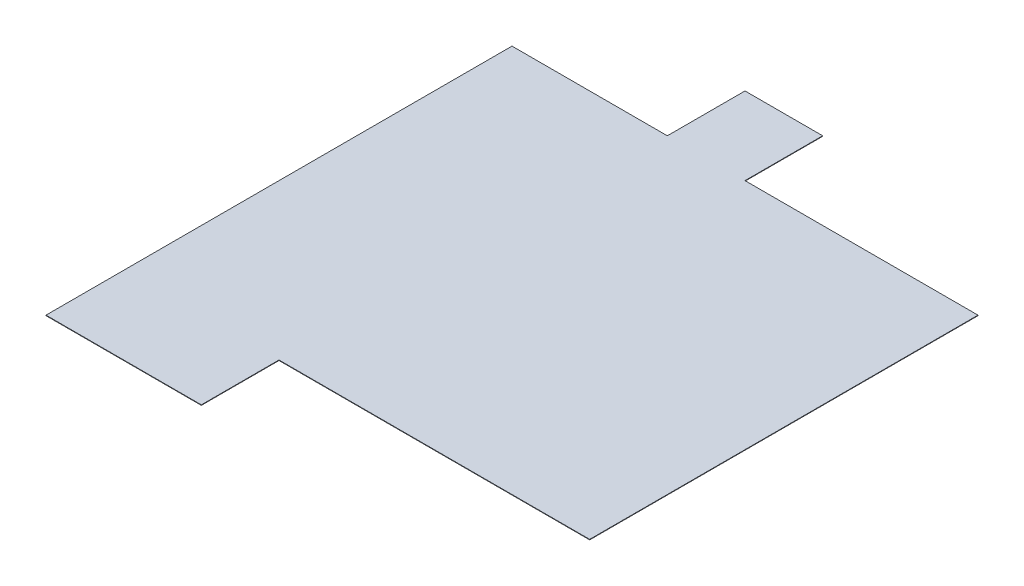
ISO-10303-21;
HEADER;
FILE_DESCRIPTION(('STEP AP214'),'2;1');
FILE_NAME('part.step','',(''),(''),'','','');
FILE_SCHEMA(('AUTOMOTIVE_DESIGN { 1 0 10303 214 1 1 1 1 }'));
ENDSEC;
DATA;
#1=APPLICATION_CONTEXT('core data for automotive mechanical design processes');
#2=APPLICATION_PROTOCOL_DEFINITION('international standard','automotive_design',2000,#1);
#3=PRODUCT_CONTEXT('',#1,'mechanical');
#4=PRODUCT('Part','Part','',(#3));
#5=PRODUCT_RELATED_PRODUCT_CATEGORY('part','',(#4));
#6=PRODUCT_DEFINITION_FORMATION('','',#4);
#7=PRODUCT_DEFINITION_CONTEXT('part definition',#1,'design');
#8=PRODUCT_DEFINITION('design','',#6,#7);
#9=PRODUCT_DEFINITION_SHAPE('','',#8);
#10=(LENGTH_UNIT() NAMED_UNIT(*) SI_UNIT(.MILLI.,.METRE.));
#11=(NAMED_UNIT(*) PLANE_ANGLE_UNIT() SI_UNIT($,.RADIAN.));
#12=(NAMED_UNIT(*) SI_UNIT($,.STERADIAN.) SOLID_ANGLE_UNIT());
#13=UNCERTAINTY_MEASURE_WITH_UNIT(LENGTH_MEASURE(1.E-05),#10,'distance_accuracy_value','');
#14=(GEOMETRIC_REPRESENTATION_CONTEXT(3) GLOBAL_UNCERTAINTY_ASSIGNED_CONTEXT((#13)) GLOBAL_UNIT_ASSIGNED_CONTEXT((#10,
#11,#12)) REPRESENTATION_CONTEXT('',''));
#15=CARTESIAN_POINT('',(0.,0.,0.));
#16=DIRECTION('',(0.,0.,1.));
#17=DIRECTION('',(1.,0.,0.));
#18=AXIS2_PLACEMENT_3D('',#15,#16,#17);
#19=CARTESIAN_POINT('',(-2400.,5.,-2800.));
#20=DIRECTION('',(0.,0.,1.));
#21=DIRECTION('',(1.,0.,0.));
#22=AXIS2_PLACEMENT_3D('',#19,#20,#21);
#23=PLANE('',#22);
#24=DIRECTION('',(0.,-1.,0.));
#25=VECTOR('',#24,1.);
#26=CARTESIAN_POINT('',(0.,5.,-2800.));
#27=LINE('',#26,#25);
#28=CARTESIAN_POINT('',(0.,5.,-2800.));
#29=VERTEX_POINT('',#28);
#30=CARTESIAN_POINT('',(0.,0.,-2800.));
#31=VERTEX_POINT('',#30);
#32=EDGE_CURVE('E119',#29,#31,#27,.T.);
#33=ORIENTED_EDGE('',*,*,#32,.F.);
#34=DIRECTION('',(-1.,0.,0.));
#35=VECTOR('',#34,1.);
#36=CARTESIAN_POINT('',(-2400.,5.,-2800.));
#37=LINE('',#36,#35);
#38=CARTESIAN_POINT('',(2400.,5.,-2800.));
#39=VERTEX_POINT('',#38);
#40=EDGE_CURVE('E130',#39,#29,#37,.T.);
#41=ORIENTED_EDGE('',*,*,#40,.F.);
#42=DIRECTION('',(0.,-1.,0.));
#43=VECTOR('',#42,1.);
#44=CARTESIAN_POINT('',(2400.,5.,-2800.));
#45=LINE('',#44,#43);
#46=CARTESIAN_POINT('',(2400.,0.,-2800.));
#47=VERTEX_POINT('',#46);
#48=EDGE_CURVE('E11',#39,#47,#45,.T.);
#49=ORIENTED_EDGE('',*,*,#48,.T.);
#50=DIRECTION('',(-1.,0.,0.));
#51=VECTOR('',#50,1.);
#52=CARTESIAN_POINT('',(-2400.,0.,-2800.));
#53=LINE('',#52,#51);
#54=EDGE_CURVE('E133',#47,#31,#53,.T.);
#55=ORIENTED_EDGE('',*,*,#54,.T.);
#56=EDGE_LOOP('',(#33,#41,#49,#55));
#57=FACE_BOUND('',#56,.T.);
#58=ADVANCED_FACE('F36',(#57),#23,.F.);
#59=CARTESIAN_POINT('',(2400.,5.,-2800.));
#60=DIRECTION('',(-1.,0.,0.));
#61=DIRECTION('',(0.,0.,1.));
#62=AXIS2_PLACEMENT_3D('',#59,#60,#61);
#63=PLANE('',#62);
#64=DIRECTION('',(0.,-1.,0.));
#65=VECTOR('',#64,1.);
#66=CARTESIAN_POINT('',(2400.00000000003,5.,1200.));
#67=LINE('',#66,#65);
#68=CARTESIAN_POINT('',(2400.00000000003,5.,1200.));
#69=VERTEX_POINT('',#68);
#70=CARTESIAN_POINT('',(2400.00000000003,0.,1200.));
#71=VERTEX_POINT('',#70);
#72=EDGE_CURVE('E152',#69,#71,#67,.T.);
#73=ORIENTED_EDGE('',*,*,#72,.T.);
#74=DIRECTION('',(0.,0.,-1.));
#75=VECTOR('',#74,1.);
#76=CARTESIAN_POINT('',(2400.,0.,-2800.));
#77=LINE('',#76,#75);
#78=EDGE_CURVE('E149',#71,#47,#77,.T.);
#79=ORIENTED_EDGE('',*,*,#78,.T.);
#80=ORIENTED_EDGE('',*,*,#48,.F.);
#81=DIRECTION('',(0.,0.,-1.));
#82=VECTOR('',#81,1.);
#83=CARTESIAN_POINT('',(2400.,5.,-2800.));
#84=LINE('',#83,#82);
#85=EDGE_CURVE('E140',#69,#39,#84,.T.);
#86=ORIENTED_EDGE('',*,*,#85,.F.);
#87=EDGE_LOOP('',(#73,#79,#80,#86));
#88=FACE_BOUND('',#87,.T.);
#89=ADVANCED_FACE('F38',(#88),#63,.F.);
#90=CARTESIAN_POINT('',(-2400.,5.,-2800.));
#91=DIRECTION('',(1.,0.,0.));
#92=DIRECTION('',(0.,0.,-1.));
#93=AXIS2_PLACEMENT_3D('',#90,#91,#92);
#94=PLANE('',#93);
#95=DIRECTION('',(0.,-1.,0.));
#96=VECTOR('',#95,1.);
#97=CARTESIAN_POINT('',(-2399.99999999996,5.,2000.));
#98=LINE('',#97,#96);
#99=CARTESIAN_POINT('',(-2399.99999999996,5.,2000.));
#100=VERTEX_POINT('',#99);
#101=CARTESIAN_POINT('',(-2400.,0.,2000.));
#102=VERTEX_POINT('',#101);
#103=EDGE_CURVE('E59',#100,#102,#98,.T.);
#104=ORIENTED_EDGE('',*,*,#103,.F.);
#105=DIRECTION('',(0.,0.,1.));
#106=VECTOR('',#105,1.);
#107=CARTESIAN_POINT('',(-2400.,5.,-2800.));
#108=LINE('',#107,#106);
#109=CARTESIAN_POINT('',(-2400.,5.,-2800.));
#110=VERTEX_POINT('',#109);
#111=EDGE_CURVE('E141',#110,#100,#108,.T.);
#112=ORIENTED_EDGE('',*,*,#111,.F.);
#113=DIRECTION('',(0.,-1.,0.));
#114=VECTOR('',#113,1.);
#115=CARTESIAN_POINT('',(-2400.,5.,-2800.));
#116=LINE('',#115,#114);
#117=CARTESIAN_POINT('',(-2400.,0.,-2800.));
#118=VERTEX_POINT('',#117);
#119=EDGE_CURVE('E44',#110,#118,#116,.T.);
#120=ORIENTED_EDGE('',*,*,#119,.T.);
#121=DIRECTION('',(0.,0.,1.));
#122=VECTOR('',#121,1.);
#123=CARTESIAN_POINT('',(-2400.,0.,-2800.));
#124=LINE('',#123,#122);
#125=EDGE_CURVE('E154',#118,#102,#124,.T.);
#126=ORIENTED_EDGE('',*,*,#125,.T.);
#127=EDGE_LOOP('',(#104,#112,#120,#126));
#128=FACE_BOUND('',#127,.T.);
#129=ADVANCED_FACE('F161',(#128),#94,.F.);
#130=CARTESIAN_POINT('',(0.,5.,0.));
#131=DIRECTION('',(0.,1.,0.));
#132=DIRECTION('',(0.,0.,1.));
#133=AXIS2_PLACEMENT_3D('',#130,#131,#132);
#134=PLANE('',#133);
#135=DIRECTION('',(0.,0.,1.));
#136=VECTOR('',#135,1.);
#137=CARTESIAN_POINT('',(-799.999999999999,5.,1200.));
#138=LINE('',#137,#136);
#139=CARTESIAN_POINT('',(-799.999999999999,5.,1200.));
#140=VERTEX_POINT('',#139);
#141=CARTESIAN_POINT('',(-799.999999999999,5.,2000.));
#142=VERTEX_POINT('',#141);
#143=EDGE_CURVE('E175',#140,#142,#138,.T.);
#144=ORIENTED_EDGE('',*,*,#143,.F.);
#145=DIRECTION('',(-1.,0.,0.));
#146=VECTOR('',#145,1.);
#147=CARTESIAN_POINT('',(-799.999999999999,5.,1200.));
#148=LINE('',#147,#146);
#149=EDGE_CURVE('E173',#69,#140,#148,.T.);
#150=ORIENTED_EDGE('',*,*,#149,.F.);
#151=ORIENTED_EDGE('',*,*,#85,.T.);
#152=ORIENTED_EDGE('',*,*,#40,.T.);
#153=DIRECTION('',(0.,0.,-1.));
#154=VECTOR('',#153,1.);
#155=CARTESIAN_POINT('',(0.,5.,-3600.));
#156=LINE('',#155,#154);
#157=CARTESIAN_POINT('',(0.,5.,-3600.));
#158=VERTEX_POINT('',#157);
#159=EDGE_CURVE('E116',#29,#158,#156,.T.);
#160=ORIENTED_EDGE('',*,*,#159,.T.);
#161=DIRECTION('',(-1.,0.,0.));
#162=VECTOR('',#161,1.);
#163=CARTESIAN_POINT('',(-799.999999999999,5.,-3600.));
#164=LINE('',#163,#162);
#165=CARTESIAN_POINT('',(-799.999999999999,5.,-3600.));
#166=VERTEX_POINT('',#165);
#167=EDGE_CURVE('E126',#158,#166,#164,.T.);
#168=ORIENTED_EDGE('',*,*,#167,.T.);
#169=DIRECTION('',(0.,0.,1.));
#170=VECTOR('',#169,1.);
#171=CARTESIAN_POINT('',(-799.999999999999,5.,-2800.));
#172=LINE('',#171,#170);
#173=CARTESIAN_POINT('',(-799.999999999999,5.,-2800.));
#174=VERTEX_POINT('',#173);
#175=EDGE_CURVE('E195',#166,#174,#172,.T.);
#176=ORIENTED_EDGE('',*,*,#175,.T.);
#177=EDGE_CURVE('E142',#174,#110,#37,.T.);
#178=ORIENTED_EDGE('',*,*,#177,.T.);
#179=ORIENTED_EDGE('',*,*,#111,.T.);
#180=DIRECTION('',(-1.,0.,0.));
#181=VECTOR('',#180,1.);
#182=CARTESIAN_POINT('',(-2399.99999999996,5.,2000.));
#183=LINE('',#182,#181);
#184=EDGE_CURVE('E182',#142,#100,#183,.T.);
#185=ORIENTED_EDGE('',*,*,#184,.F.);
#186=EDGE_LOOP('',(#144,#150,#151,#152,#160,#168,#176,#178,#179,#185));
#187=FACE_BOUND('',#186,.T.);
#188=ADVANCED_FACE('F137',(#187),#134,.T.);
#189=CARTESIAN_POINT('',(0.,0.,0.));
#190=DIRECTION('',(0.,1.,0.));
#191=DIRECTION('',(0.,0.,1.));
#192=AXIS2_PLACEMENT_3D('',#189,#190,#191);
#193=PLANE('',#192);
#194=DIRECTION('',(-1.,0.,0.));
#195=VECTOR('',#194,1.);
#196=CARTESIAN_POINT('',(-799.999999999999,0.,1200.));
#197=LINE('',#196,#195);
#198=CARTESIAN_POINT('',(-799.999999999999,0.,1200.));
#199=VERTEX_POINT('',#198);
#200=EDGE_CURVE('E134',#71,#199,#197,.T.);
#201=ORIENTED_EDGE('',*,*,#200,.T.);
#202=DIRECTION('',(0.,0.,1.));
#203=VECTOR('',#202,1.);
#204=CARTESIAN_POINT('',(-799.999999999999,0.,1200.));
#205=LINE('',#204,#203);
#206=CARTESIAN_POINT('',(-799.999999999999,0.,2000.));
#207=VERTEX_POINT('',#206);
#208=EDGE_CURVE('E171',#199,#207,#205,.T.);
#209=ORIENTED_EDGE('',*,*,#208,.T.);
#210=DIRECTION('',(-1.,0.,0.));
#211=VECTOR('',#210,1.);
#212=CARTESIAN_POINT('',(-2399.99999999996,0.,2000.));
#213=LINE('',#212,#211);
#214=EDGE_CURVE('E169',#207,#102,#213,.T.);
#215=ORIENTED_EDGE('',*,*,#214,.T.);
#216=ORIENTED_EDGE('',*,*,#125,.F.);
#217=CARTESIAN_POINT('',(-799.999999999999,0.,-2800.));
#218=VERTEX_POINT('',#217);
#219=EDGE_CURVE('E151',#218,#118,#53,.T.);
#220=ORIENTED_EDGE('',*,*,#219,.F.);
#221=DIRECTION('',(0.,0.,1.));
#222=VECTOR('',#221,1.);
#223=CARTESIAN_POINT('',(-799.999999999999,0.,-2800.));
#224=LINE('',#223,#222);
#225=CARTESIAN_POINT('',(-799.999999999999,0.,-3600.));
#226=VERTEX_POINT('',#225);
#227=EDGE_CURVE('E51',#226,#218,#224,.T.);
#228=ORIENTED_EDGE('',*,*,#227,.F.);
#229=DIRECTION('',(-1.,0.,0.));
#230=VECTOR('',#229,1.);
#231=CARTESIAN_POINT('',(-799.999999999999,0.,-3600.));
#232=LINE('',#231,#230);
#233=CARTESIAN_POINT('',(0.,0.,-3600.));
#234=VERTEX_POINT('',#233);
#235=EDGE_CURVE('E191',#234,#226,#232,.T.);
#236=ORIENTED_EDGE('',*,*,#235,.F.);
#237=DIRECTION('',(0.,0.,-1.));
#238=VECTOR('',#237,1.);
#239=CARTESIAN_POINT('',(0.,0.,-3600.));
#240=LINE('',#239,#238);
#241=EDGE_CURVE('E190',#31,#234,#240,.T.);
#242=ORIENTED_EDGE('',*,*,#241,.F.);
#243=ORIENTED_EDGE('',*,*,#54,.F.);
#244=ORIENTED_EDGE('',*,*,#78,.F.);
#245=EDGE_LOOP('',(#201,#209,#215,#216,#220,#228,#236,#242,#243,#244));
#246=FACE_BOUND('',#245,.T.);
#247=ADVANCED_FACE('F167',(#246),#193,.F.);
#248=ORIENTED_EDGE('',*,*,#177,.F.);
#249=DIRECTION('',(0.,-1.,0.));
#250=VECTOR('',#249,1.);
#251=CARTESIAN_POINT('',(-799.999999999999,5.,-2800.));
#252=LINE('',#251,#250);
#253=EDGE_CURVE('E199',#174,#218,#252,.T.);
#254=ORIENTED_EDGE('',*,*,#253,.T.);
#255=ORIENTED_EDGE('',*,*,#219,.T.);
#256=ORIENTED_EDGE('',*,*,#119,.F.);
#257=EDGE_LOOP('',(#248,#254,#255,#256));
#258=FACE_BOUND('',#257,.T.);
#259=ADVANCED_FACE('F208',(#258),#23,.F.);
#260=CARTESIAN_POINT('',(-799.999999999999,5.,1200.));
#261=DIRECTION('',(0.,0.,1.));
#262=DIRECTION('',(1.,0.,0.));
#263=AXIS2_PLACEMENT_3D('',#260,#261,#262);
#264=PLANE('',#263);
#265=ORIENTED_EDGE('',*,*,#200,.F.);
#266=ORIENTED_EDGE('',*,*,#72,.F.);
#267=ORIENTED_EDGE('',*,*,#149,.T.);
#268=DIRECTION('',(0.,-1.,0.));
#269=VECTOR('',#268,1.);
#270=CARTESIAN_POINT('',(-799.999999999999,5.,1200.));
#271=LINE('',#270,#269);
#272=EDGE_CURVE('E184',#140,#199,#271,.T.);
#273=ORIENTED_EDGE('',*,*,#272,.T.);
#274=EDGE_LOOP('',(#265,#266,#267,#273));
#275=FACE_BOUND('',#274,.T.);
#276=ADVANCED_FACE('F227',(#275),#264,.T.);
#277=CARTESIAN_POINT('',(-799.999999999999,5.,1200.));
#278=DIRECTION('',(1.,0.,0.));
#279=DIRECTION('',(0.,0.,-1.));
#280=AXIS2_PLACEMENT_3D('',#277,#278,#279);
#281=PLANE('',#280);
#282=ORIENTED_EDGE('',*,*,#208,.F.);
#283=ORIENTED_EDGE('',*,*,#272,.F.);
#284=ORIENTED_EDGE('',*,*,#143,.T.);
#285=DIRECTION('',(0.,-1.,0.));
#286=VECTOR('',#285,1.);
#287=CARTESIAN_POINT('',(-799.999999999999,5.,2000.));
#288=LINE('',#287,#286);
#289=EDGE_CURVE('E181',#142,#207,#288,.T.);
#290=ORIENTED_EDGE('',*,*,#289,.T.);
#291=EDGE_LOOP('',(#282,#283,#284,#290));
#292=FACE_BOUND('',#291,.T.);
#293=ADVANCED_FACE('F232',(#292),#281,.T.);
#294=CARTESIAN_POINT('',(-2399.99999999996,5.,2000.));
#295=DIRECTION('',(0.,0.,1.));
#296=DIRECTION('',(1.,0.,0.));
#297=AXIS2_PLACEMENT_3D('',#294,#295,#296);
#298=PLANE('',#297);
#299=ORIENTED_EDGE('',*,*,#214,.F.);
#300=ORIENTED_EDGE('',*,*,#289,.F.);
#301=ORIENTED_EDGE('',*,*,#184,.T.);
#302=ORIENTED_EDGE('',*,*,#103,.T.);
#303=EDGE_LOOP('',(#299,#300,#301,#302));
#304=FACE_BOUND('',#303,.T.);
#305=ADVANCED_FACE('F206',(#304),#298,.T.);
#306=CARTESIAN_POINT('',(0.,5.,-3600.));
#307=DIRECTION('',(-1.,0.,0.));
#308=DIRECTION('',(0.,0.,1.));
#309=AXIS2_PLACEMENT_3D('',#306,#307,#308);
#310=PLANE('',#309);
#311=ORIENTED_EDGE('',*,*,#241,.T.);
#312=DIRECTION('',(0.,-1.,0.));
#313=VECTOR('',#312,1.);
#314=CARTESIAN_POINT('',(0.,5.,-3600.));
#315=LINE('',#314,#313);
#316=EDGE_CURVE('E122',#158,#234,#315,.T.);
#317=ORIENTED_EDGE('',*,*,#316,.F.);
#318=ORIENTED_EDGE('',*,*,#159,.F.);
#319=ORIENTED_EDGE('',*,*,#32,.T.);
#320=EDGE_LOOP('',(#311,#317,#318,#319));
#321=FACE_BOUND('',#320,.T.);
#322=ADVANCED_FACE('F118',(#321),#310,.F.);
#323=CARTESIAN_POINT('',(-799.999999999999,5.,-3600.));
#324=DIRECTION('',(0.,0.,1.));
#325=DIRECTION('',(1.,0.,0.));
#326=AXIS2_PLACEMENT_3D('',#323,#324,#325);
#327=PLANE('',#326);
#328=ORIENTED_EDGE('',*,*,#235,.T.);
#329=DIRECTION('',(0.,-1.,0.));
#330=VECTOR('',#329,1.);
#331=CARTESIAN_POINT('',(-799.999999999999,5.,-3600.));
#332=LINE('',#331,#330);
#333=EDGE_CURVE('E201',#166,#226,#332,.T.);
#334=ORIENTED_EDGE('',*,*,#333,.F.);
#335=ORIENTED_EDGE('',*,*,#167,.F.);
#336=ORIENTED_EDGE('',*,*,#316,.T.);
#337=EDGE_LOOP('',(#328,#334,#335,#336));
#338=FACE_BOUND('',#337,.T.);
#339=ADVANCED_FACE('F212',(#338),#327,.F.);
#340=CARTESIAN_POINT('',(-799.999999999999,5.,-2800.));
#341=DIRECTION('',(1.,0.,0.));
#342=DIRECTION('',(0.,0.,-1.));
#343=AXIS2_PLACEMENT_3D('',#340,#341,#342);
#344=PLANE('',#343);
#345=ORIENTED_EDGE('',*,*,#227,.T.);
#346=ORIENTED_EDGE('',*,*,#253,.F.);
#347=ORIENTED_EDGE('',*,*,#175,.F.);
#348=ORIENTED_EDGE('',*,*,#333,.T.);
#349=EDGE_LOOP('',(#345,#346,#347,#348));
#350=FACE_BOUND('',#349,.T.);
#351=ADVANCED_FACE('F209',(#350),#344,.F.);
#352=CLOSED_SHELL('',(#58,#89,#129,#188,#247,#259,#276,#293,#305,#322,#339,#351));
#353=MANIFOLD_SOLID_BREP('B2',#352);
#354=ADVANCED_BREP_SHAPE_REPRESENTATION('',(#18,#353),#14);
#355=SHAPE_DEFINITION_REPRESENTATION(#9,#354);
ENDSEC;
END-ISO-10303-21;
